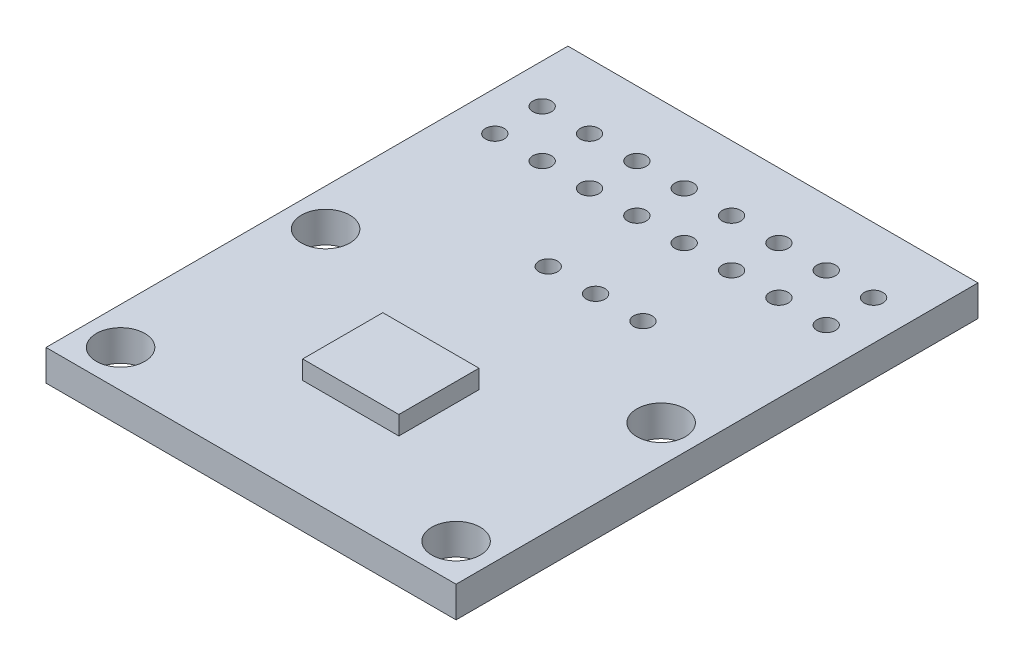
ISO-10303-21;
HEADER;
FILE_DESCRIPTION(('STEP AP214'),'2;1');
FILE_NAME('part.step','',(''),(''),'','','');
FILE_SCHEMA(('AUTOMOTIVE_DESIGN { 1 0 10303 214 1 1 1 1 }'));
ENDSEC;
DATA;
#1=APPLICATION_CONTEXT('core data for automotive mechanical design processes');
#2=APPLICATION_PROTOCOL_DEFINITION('international standard','automotive_design',2000,#1);
#3=PRODUCT_CONTEXT('',#1,'mechanical');
#4=PRODUCT('Part','Part','',(#3));
#5=PRODUCT_RELATED_PRODUCT_CATEGORY('part','',(#4));
#6=PRODUCT_DEFINITION_FORMATION('','',#4);
#7=PRODUCT_DEFINITION_CONTEXT('part definition',#1,'design');
#8=PRODUCT_DEFINITION('design','',#6,#7);
#9=PRODUCT_DEFINITION_SHAPE('','',#8);
#10=(LENGTH_UNIT() NAMED_UNIT(*) SI_UNIT(.MILLI.,.METRE.));
#11=(NAMED_UNIT(*) PLANE_ANGLE_UNIT() SI_UNIT($,.RADIAN.));
#12=(NAMED_UNIT(*) SI_UNIT($,.STERADIAN.) SOLID_ANGLE_UNIT());
#13=UNCERTAINTY_MEASURE_WITH_UNIT(LENGTH_MEASURE(1.E-05),#10,'distance_accuracy_value','');
#14=(GEOMETRIC_REPRESENTATION_CONTEXT(3) GLOBAL_UNCERTAINTY_ASSIGNED_CONTEXT((#13)) GLOBAL_UNIT_ASSIGNED_CONTEXT((#10,
#11,#12)) REPRESENTATION_CONTEXT('',''));
#15=CARTESIAN_POINT('',(0.,0.,0.));
#16=DIRECTION('',(0.,0.,1.));
#17=DIRECTION('',(1.,0.,0.));
#18=AXIS2_PLACEMENT_3D('',#15,#16,#17);
#19=CARTESIAN_POINT('',(0.,0.83,0.));
#20=DIRECTION('',(0.,1.,0.));
#21=DIRECTION('',(0.,0.,1.));
#22=AXIS2_PLACEMENT_3D('',#19,#20,#21);
#23=PLANE('',#22);
#24=CARTESIAN_POINT('',(6.35,0.83,-7.96862600459158));
#25=DIRECTION('',(0.,1.,0.));
#26=DIRECTION('',(0.,0.,1.));
#27=AXIS2_PLACEMENT_3D('',#24,#25,#26);
#28=CIRCLE('',#27,0.499999999999999);
#29=CARTESIAN_POINT('',(6.35,0.83,-7.46862600459158));
#30=VERTEX_POINT('',#29);
#31=EDGE_CURVE('E490',#30,#30,#28,.T.);
#32=ORIENTED_EDGE('',*,*,#31,.F.);
#33=EDGE_LOOP('',(#32));
#34=FACE_BOUND('',#33,.T.);
#35=CARTESIAN_POINT('',(3.81,0.83,-10.5086260045916));
#36=DIRECTION('',(0.,1.,0.));
#37=DIRECTION('',(0.,0.,1.));
#38=AXIS2_PLACEMENT_3D('',#35,#36,#37);
#39=CIRCLE('',#38,0.499999999999999);
#40=CARTESIAN_POINT('',(3.81,0.83,-10.0086260045916));
#41=VERTEX_POINT('',#40);
#42=EDGE_CURVE('E493',#41,#41,#39,.T.);
#43=ORIENTED_EDGE('',*,*,#42,.F.);
#44=EDGE_LOOP('',(#43));
#45=FACE_BOUND('',#44,.T.);
#46=CARTESIAN_POINT('',(3.81,0.83,-7.96862600459158));
#47=DIRECTION('',(0.,1.,0.));
#48=DIRECTION('',(0.,0.,1.));
#49=AXIS2_PLACEMENT_3D('',#46,#47,#48);
#50=CIRCLE('',#49,0.499999999999999);
#51=CARTESIAN_POINT('',(3.81,0.83,-7.46862600459158));
#52=VERTEX_POINT('',#51);
#53=EDGE_CURVE('E510',#52,#52,#50,.T.);
#54=ORIENTED_EDGE('',*,*,#53,.F.);
#55=EDGE_LOOP('',(#54));
#56=FACE_BOUND('',#55,.T.);
#57=CARTESIAN_POINT('',(1.27,0.83,-10.5086260045916));
#58=DIRECTION('',(0.,1.,0.));
#59=DIRECTION('',(0.,0.,1.));
#60=AXIS2_PLACEMENT_3D('',#57,#58,#59);
#61=CIRCLE('',#60,0.499999999999999);
#62=CARTESIAN_POINT('',(1.27,0.83,-10.0086260045916));
#63=VERTEX_POINT('',#62);
#64=EDGE_CURVE('E504',#63,#63,#61,.T.);
#65=ORIENTED_EDGE('',*,*,#64,.F.);
#66=EDGE_LOOP('',(#65));
#67=FACE_BOUND('',#66,.T.);
#68=CARTESIAN_POINT('',(-1.28836294207396,0.83,-3.23273590840458));
#69=DIRECTION('',(0.,1.,0.));
#70=DIRECTION('',(0.,0.,1.));
#71=AXIS2_PLACEMENT_3D('',#68,#69,#70);
#72=CIRCLE('',#71,0.499999999999999);
#73=CARTESIAN_POINT('',(-1.28836294207396,0.83,-2.73273590840458));
#74=VERTEX_POINT('',#73);
#75=EDGE_CURVE('E665',#74,#74,#72,.T.);
#76=ORIENTED_EDGE('',*,*,#75,.F.);
#77=EDGE_LOOP('',(#76));
#78=FACE_BOUND('',#77,.T.);
#79=CARTESIAN_POINT('',(8.89,0.83,-10.5086260045916));
#80=DIRECTION('',(0.,1.,0.));
#81=DIRECTION('',(0.,0.,1.));
#82=AXIS2_PLACEMENT_3D('',#79,#80,#81);
#83=CIRCLE('',#82,0.499999999999999);
#84=CARTESIAN_POINT('',(8.89,0.83,-10.0086260045916));
#85=VERTEX_POINT('',#84);
#86=EDGE_CURVE('E659',#85,#85,#83,.T.);
#87=ORIENTED_EDGE('',*,*,#86,.F.);
#88=EDGE_LOOP('',(#87));
#89=FACE_BOUND('',#88,.T.);
#90=CARTESIAN_POINT('',(8.89,0.83,-7.96862600459158));
#91=DIRECTION('',(0.,1.,0.));
#92=DIRECTION('',(0.,0.,1.));
#93=AXIS2_PLACEMENT_3D('',#90,#91,#92);
#94=CIRCLE('',#93,0.499999999999999);
#95=CARTESIAN_POINT('',(8.89,0.83,-7.46862600459158));
#96=VERTEX_POINT('',#95);
#97=EDGE_CURVE('E658',#96,#96,#94,.T.);
#98=ORIENTED_EDGE('',*,*,#97,.F.);
#99=EDGE_LOOP('',(#98));
#100=FACE_BOUND('',#99,.T.);
#101=CARTESIAN_POINT('',(6.35,0.83,-10.5086260045916));
#102=DIRECTION('',(0.,1.,0.));
#103=DIRECTION('',(0.,0.,1.));
#104=AXIS2_PLACEMENT_3D('',#101,#102,#103);
#105=CIRCLE('',#104,0.499999999999999);
#106=CARTESIAN_POINT('',(6.35,0.83,-10.0086260045916));
#107=VERTEX_POINT('',#106);
#108=EDGE_CURVE('E496',#107,#107,#105,.T.);
#109=ORIENTED_EDGE('',*,*,#108,.F.);
#110=EDGE_LOOP('',(#109));
#111=FACE_BOUND('',#110,.T.);
#112=CARTESIAN_POINT('',(-3.81,0.83,-7.96862600459158));
#113=DIRECTION('',(0.,1.,0.));
#114=DIRECTION('',(0.,0.,1.));
#115=AXIS2_PLACEMENT_3D('',#112,#113,#114);
#116=CIRCLE('',#115,0.499999999999999);
#117=CARTESIAN_POINT('',(-3.81,0.83,-7.46862600459158));
#118=VERTEX_POINT('',#117);
#119=EDGE_CURVE('E529',#118,#118,#116,.T.);
#120=ORIENTED_EDGE('',*,*,#119,.F.);
#121=EDGE_LOOP('',(#120));
#122=FACE_BOUND('',#121,.T.);
#123=CARTESIAN_POINT('',(-6.35,0.83,-10.5086260045916));
#124=DIRECTION('',(0.,1.,0.));
#125=DIRECTION('',(0.,0.,1.));
#126=AXIS2_PLACEMENT_3D('',#123,#124,#125);
#127=CIRCLE('',#126,0.499999999999999);
#128=CARTESIAN_POINT('',(-6.35,0.83,-10.0086260045916));
#129=VERTEX_POINT('',#128);
#130=EDGE_CURVE('E542',#129,#129,#127,.T.);
#131=ORIENTED_EDGE('',*,*,#130,.F.);
#132=EDGE_LOOP('',(#131));
#133=FACE_BOUND('',#132,.T.);
#134=CARTESIAN_POINT('',(-6.35,0.83,-7.96862600459158));
#135=DIRECTION('',(0.,1.,0.));
#136=DIRECTION('',(0.,0.,1.));
#137=AXIS2_PLACEMENT_3D('',#134,#135,#136);
#138=CIRCLE('',#137,0.499999999999999);
#139=CARTESIAN_POINT('',(-6.35,0.83,-7.46862600459158));
#140=VERTEX_POINT('',#139);
#141=EDGE_CURVE('E541',#140,#140,#138,.T.);
#142=ORIENTED_EDGE('',*,*,#141,.F.);
#143=EDGE_LOOP('',(#142));
#144=FACE_BOUND('',#143,.T.);
#145=CARTESIAN_POINT('',(-8.89,0.83,-10.5086260045916));
#146=DIRECTION('',(0.,1.,0.));
#147=DIRECTION('',(0.,0.,1.));
#148=AXIS2_PLACEMENT_3D('',#145,#146,#147);
#149=CIRCLE('',#148,0.499999999999999);
#150=CARTESIAN_POINT('',(-8.89,0.83,-10.0086260045916));
#151=VERTEX_POINT('',#150);
#152=EDGE_CURVE('E554',#151,#151,#149,.T.);
#153=ORIENTED_EDGE('',*,*,#152,.F.);
#154=EDGE_LOOP('',(#153));
#155=FACE_BOUND('',#154,.T.);
#156=CARTESIAN_POINT('',(1.27,0.83,-7.96862600459158));
#157=DIRECTION('',(0.,1.,0.));
#158=DIRECTION('',(0.,0.,1.));
#159=AXIS2_PLACEMENT_3D('',#156,#157,#158);
#160=CIRCLE('',#159,0.499999999999999);
#161=CARTESIAN_POINT('',(1.27,0.83,-7.46862600459158));
#162=VERTEX_POINT('',#161);
#163=EDGE_CURVE('E503',#162,#162,#160,.T.);
#164=ORIENTED_EDGE('',*,*,#163,.F.);
#165=EDGE_LOOP('',(#164));
#166=FACE_BOUND('',#165,.T.);
#167=CARTESIAN_POINT('',(-1.27,0.83,-10.5086260045916));
#168=DIRECTION('',(0.,1.,0.));
#169=DIRECTION('',(0.,0.,1.));
#170=AXIS2_PLACEMENT_3D('',#167,#168,#169);
#171=CIRCLE('',#170,0.499999999999999);
#172=CARTESIAN_POINT('',(-1.27,0.83,-10.0086260045916));
#173=VERTEX_POINT('',#172);
#174=EDGE_CURVE('E518',#173,#173,#171,.T.);
#175=ORIENTED_EDGE('',*,*,#174,.F.);
#176=EDGE_LOOP('',(#175));
#177=FACE_BOUND('',#176,.T.);
#178=CARTESIAN_POINT('',(-1.27,0.83,-7.96862600459158));
#179=DIRECTION('',(0.,1.,0.));
#180=DIRECTION('',(0.,0.,1.));
#181=AXIS2_PLACEMENT_3D('',#178,#179,#180);
#182=CIRCLE('',#181,0.499999999999999);
#183=CARTESIAN_POINT('',(-1.27,0.83,-7.46862600459158));
#184=VERTEX_POINT('',#183);
#185=EDGE_CURVE('E517',#184,#184,#182,.T.);
#186=ORIENTED_EDGE('',*,*,#185,.F.);
#187=EDGE_LOOP('',(#186));
#188=FACE_BOUND('',#187,.T.);
#189=CARTESIAN_POINT('',(-3.81,0.83,-10.5086260045916));
#190=DIRECTION('',(0.,1.,0.));
#191=DIRECTION('',(0.,0.,1.));
#192=AXIS2_PLACEMENT_3D('',#189,#190,#191);
#193=CIRCLE('',#192,0.499999999999999);
#194=CARTESIAN_POINT('',(-3.81,0.83,-10.0086260045916));
#195=VERTEX_POINT('',#194);
#196=EDGE_CURVE('E530',#195,#195,#193,.T.);
#197=ORIENTED_EDGE('',*,*,#196,.F.);
#198=EDGE_LOOP('',(#197));
#199=FACE_BOUND('',#198,.T.);
#200=CARTESIAN_POINT('',(1.25163705792605,0.83,-3.23273590840458));
#201=DIRECTION('',(0.,1.,0.));
#202=DIRECTION('',(0.,0.,1.));
#203=AXIS2_PLACEMENT_3D('',#200,#201,#202);
#204=CIRCLE('',#203,0.499999999999999);
#205=CARTESIAN_POINT('',(1.25163705792605,0.83,-2.73273590840458));
#206=VERTEX_POINT('',#205);
#207=EDGE_CURVE('E644',#206,#206,#204,.T.);
#208=ORIENTED_EDGE('',*,*,#207,.F.);
#209=EDGE_LOOP('',(#208));
#210=FACE_BOUND('',#209,.T.);
#211=CARTESIAN_POINT('',(3.79163705792605,0.83,-3.23273590840458));
#212=DIRECTION('',(0.,1.,0.));
#213=DIRECTION('',(0.,0.,1.));
#214=AXIS2_PLACEMENT_3D('',#211,#212,#213);
#215=CIRCLE('',#214,0.499999999999999);
#216=CARTESIAN_POINT('',(3.79163705792605,0.83,-2.73273590840458));
#217=VERTEX_POINT('',#216);
#218=EDGE_CURVE('E647',#217,#217,#215,.T.);
#219=ORIENTED_EDGE('',*,*,#218,.F.);
#220=EDGE_LOOP('',(#219));
#221=FACE_BOUND('',#220,.T.);
#222=CARTESIAN_POINT('',(-8.89,0.83,-7.96862600459158));
#223=DIRECTION('',(0.,1.,0.));
#224=DIRECTION('',(0.,0.,1.));
#225=AXIS2_PLACEMENT_3D('',#222,#223,#224);
#226=CIRCLE('',#225,0.499999999999999);
#227=CARTESIAN_POINT('',(-8.89,0.83,-7.46862600459158));
#228=VERTEX_POINT('',#227);
#229=EDGE_CURVE('E553',#228,#228,#226,.T.);
#230=ORIENTED_EDGE('',*,*,#229,.F.);
#231=EDGE_LOOP('',(#230));
#232=FACE_BOUND('',#231,.T.);
#233=CARTESIAN_POINT('',(-9.,0.83,1.));
#234=DIRECTION('',(0.,1.,0.));
#235=DIRECTION('',(0.,0.,1.));
#236=AXIS2_PLACEMENT_3D('',#233,#234,#235);
#237=CIRCLE('',#236,1.29999999999999);
#238=CARTESIAN_POINT('',(-9.,0.83,2.29999999999999));
#239=VERTEX_POINT('',#238);
#240=EDGE_CURVE('E570',#239,#239,#237,.T.);
#241=ORIENTED_EDGE('',*,*,#240,.F.);
#242=EDGE_LOOP('',(#241));
#243=FACE_BOUND('',#242,.T.);
#244=CARTESIAN_POINT('',(9.,0.83,1.));
#245=DIRECTION('',(0.,1.,0.));
#246=DIRECTION('',(0.,0.,1.));
#247=AXIS2_PLACEMENT_3D('',#244,#245,#246);
#248=CIRCLE('',#247,1.29999999999999);
#249=CARTESIAN_POINT('',(9.,0.83,2.29999999999999));
#250=VERTEX_POINT('',#249);
#251=EDGE_CURVE('E576',#250,#250,#248,.T.);
#252=ORIENTED_EDGE('',*,*,#251,.F.);
#253=EDGE_LOOP('',(#252));
#254=FACE_BOUND('',#253,.T.);
#255=CARTESIAN_POINT('',(-9.,0.83,12.));
#256=DIRECTION('',(0.,1.,0.));
#257=DIRECTION('',(0.,0.,1.));
#258=AXIS2_PLACEMENT_3D('',#255,#256,#257);
#259=CIRCLE('',#258,1.29999999999999);
#260=CARTESIAN_POINT('',(-9.,0.83,13.3));
#261=VERTEX_POINT('',#260);
#262=EDGE_CURVE('E582',#261,#261,#259,.T.);
#263=ORIENTED_EDGE('',*,*,#262,.F.);
#264=EDGE_LOOP('',(#263));
#265=FACE_BOUND('',#264,.T.);
#266=CARTESIAN_POINT('',(9.,0.83,12.));
#267=DIRECTION('',(0.,1.,0.));
#268=DIRECTION('',(0.,0.,1.));
#269=AXIS2_PLACEMENT_3D('',#266,#267,#268);
#270=CIRCLE('',#269,1.29999999999999);
#271=CARTESIAN_POINT('',(9.,0.83,13.3));
#272=VERTEX_POINT('',#271);
#273=EDGE_CURVE('E588',#272,#272,#270,.T.);
#274=ORIENTED_EDGE('',*,*,#273,.F.);
#275=EDGE_LOOP('',(#274));
#276=FACE_BOUND('',#275,.T.);
#277=DIRECTION('',(1.,0.,0.));
#278=VECTOR('',#277,1.);
#279=CARTESIAN_POINT('',(-11.,0.83,14.));
#280=LINE('',#279,#278);
#281=CARTESIAN_POINT('',(-11.,0.83,14.));
#282=VERTEX_POINT('',#281);
#283=CARTESIAN_POINT('',(11.,0.83,14.));
#284=VERTEX_POINT('',#283);
#285=EDGE_CURVE('E132',#282,#284,#280,.T.);
#286=ORIENTED_EDGE('',*,*,#285,.T.);
#287=DIRECTION('',(0.,0.,-1.));
#288=VECTOR('',#287,1.);
#289=CARTESIAN_POINT('',(11.,0.83,14.));
#290=LINE('',#289,#288);
#291=CARTESIAN_POINT('',(11.,0.83,-14.));
#292=VERTEX_POINT('',#291);
#293=EDGE_CURVE('E135',#284,#292,#290,.T.);
#294=ORIENTED_EDGE('',*,*,#293,.T.);
#295=DIRECTION('',(-1.,0.,0.));
#296=VECTOR('',#295,1.);
#297=CARTESIAN_POINT('',(11.,0.83,-14.));
#298=LINE('',#297,#296);
#299=CARTESIAN_POINT('',(-11.,0.83,-14.));
#300=VERTEX_POINT('',#299);
#301=EDGE_CURVE('E152',#292,#300,#298,.T.);
#302=ORIENTED_EDGE('',*,*,#301,.T.);
#303=DIRECTION('',(0.,0.,1.));
#304=VECTOR('',#303,1.);
#305=CARTESIAN_POINT('',(-11.,0.83,-14.));
#306=LINE('',#305,#304);
#307=EDGE_CURVE('E143',#300,#282,#306,.T.);
#308=ORIENTED_EDGE('',*,*,#307,.T.);
#309=EDGE_LOOP('',(#286,#294,#302,#308));
#310=FACE_BOUND('',#309,.T.);
#311=DIRECTION('',(-1.,0.,0.));
#312=VECTOR('',#311,1.);
#313=CARTESIAN_POINT('',(-2.58,0.83,4.35));
#314=LINE('',#313,#312);
#315=CARTESIAN_POINT('',(2.58,0.83,4.35));
#316=VERTEX_POINT('',#315);
#317=CARTESIAN_POINT('',(-2.58,0.83,4.35));
#318=VERTEX_POINT('',#317);
#319=EDGE_CURVE('E595',#316,#318,#314,.T.);
#320=ORIENTED_EDGE('',*,*,#319,.F.);
#321=DIRECTION('',(0.,0.,-1.));
#322=VECTOR('',#321,1.);
#323=CARTESIAN_POINT('',(2.58,0.83,4.35));
#324=LINE('',#323,#322);
#325=CARTESIAN_POINT('',(2.58,0.83,8.65));
#326=VERTEX_POINT('',#325);
#327=EDGE_CURVE('E130',#326,#316,#324,.T.);
#328=ORIENTED_EDGE('',*,*,#327,.F.);
#329=DIRECTION('',(1.,0.,0.));
#330=VECTOR('',#329,1.);
#331=CARTESIAN_POINT('',(2.58,0.83,8.65));
#332=LINE('',#331,#330);
#333=CARTESIAN_POINT('',(-2.58,0.83,8.65));
#334=VERTEX_POINT('',#333);
#335=EDGE_CURVE('E126',#334,#326,#332,.T.);
#336=ORIENTED_EDGE('',*,*,#335,.F.);
#337=DIRECTION('',(0.,0.,1.));
#338=VECTOR('',#337,1.);
#339=CARTESIAN_POINT('',(-2.58,0.83,8.65));
#340=LINE('',#339,#338);
#341=EDGE_CURVE('E597',#318,#334,#340,.T.);
#342=ORIENTED_EDGE('',*,*,#341,.F.);
#343=EDGE_LOOP('',(#320,#328,#336,#342));
#344=FACE_BOUND('',#343,.T.);
#345=ADVANCED_FACE('F34',(#34,#45,#56,#67,#78,#89,#100,#111,#122,#133,#144,#155,#166,#177,#188,
#199,#210,#221,#232,#243,#254,#265,#276,#310,#344),#23,.T.);
#346=CARTESIAN_POINT('',(-11.,-0.83,14.));
#347=DIRECTION('',(0.,0.,1.));
#348=DIRECTION('',(1.,0.,0.));
#349=AXIS2_PLACEMENT_3D('',#346,#347,#348);
#350=PLANE('',#349);
#351=ORIENTED_EDGE('',*,*,#285,.F.);
#352=DIRECTION('',(0.,1.,0.));
#353=VECTOR('',#352,1.);
#354=CARTESIAN_POINT('',(-11.,-0.83,14.));
#355=LINE('',#354,#353);
#356=CARTESIAN_POINT('',(-11.,-0.83,14.));
#357=VERTEX_POINT('',#356);
#358=EDGE_CURVE('E11',#357,#282,#355,.T.);
#359=ORIENTED_EDGE('',*,*,#358,.F.);
#360=DIRECTION('',(1.,0.,0.));
#361=VECTOR('',#360,1.);
#362=CARTESIAN_POINT('',(-11.,-0.83,14.));
#363=LINE('',#362,#361);
#364=CARTESIAN_POINT('',(11.,-0.83,14.));
#365=VERTEX_POINT('',#364);
#366=EDGE_CURVE('E140',#357,#365,#363,.T.);
#367=ORIENTED_EDGE('',*,*,#366,.T.);
#368=DIRECTION('',(0.,1.,0.));
#369=VECTOR('',#368,1.);
#370=CARTESIAN_POINT('',(11.,-0.83,14.));
#371=LINE('',#370,#369);
#372=EDGE_CURVE('E38',#365,#284,#371,.T.);
#373=ORIENTED_EDGE('',*,*,#372,.T.);
#374=EDGE_LOOP('',(#351,#359,#367,#373));
#375=FACE_BOUND('',#374,.T.);
#376=ADVANCED_FACE('F36',(#375),#350,.T.);
#377=CARTESIAN_POINT('',(-11.,-0.83,-14.));
#378=DIRECTION('',(-1.,0.,0.));
#379=DIRECTION('',(0.,0.,1.));
#380=AXIS2_PLACEMENT_3D('',#377,#378,#379);
#381=PLANE('',#380);
#382=ORIENTED_EDGE('',*,*,#307,.F.);
#383=DIRECTION('',(0.,1.,0.));
#384=VECTOR('',#383,1.);
#385=CARTESIAN_POINT('',(-11.,-0.83,-14.));
#386=LINE('',#385,#384);
#387=CARTESIAN_POINT('',(-11.,-0.83,-14.));
#388=VERTEX_POINT('',#387);
#389=EDGE_CURVE('E43',#388,#300,#386,.T.);
#390=ORIENTED_EDGE('',*,*,#389,.F.);
#391=DIRECTION('',(0.,0.,1.));
#392=VECTOR('',#391,1.);
#393=CARTESIAN_POINT('',(-11.,-0.83,-14.));
#394=LINE('',#393,#392);
#395=EDGE_CURVE('E148',#388,#357,#394,.T.);
#396=ORIENTED_EDGE('',*,*,#395,.T.);
#397=ORIENTED_EDGE('',*,*,#358,.T.);
#398=EDGE_LOOP('',(#382,#390,#396,#397));
#399=FACE_BOUND('',#398,.T.);
#400=ADVANCED_FACE('F162',(#399),#381,.T.);
#401=CARTESIAN_POINT('',(11.,-0.83,-14.));
#402=DIRECTION('',(0.,0.,-1.));
#403=DIRECTION('',(-1.,0.,0.));
#404=AXIS2_PLACEMENT_3D('',#401,#402,#403);
#405=PLANE('',#404);
#406=ORIENTED_EDGE('',*,*,#301,.F.);
#407=DIRECTION('',(0.,1.,0.));
#408=VECTOR('',#407,1.);
#409=CARTESIAN_POINT('',(11.,-0.83,-14.));
#410=LINE('',#409,#408);
#411=CARTESIAN_POINT('',(11.,-0.83,-14.));
#412=VERTEX_POINT('',#411);
#413=EDGE_CURVE('E157',#412,#292,#410,.T.);
#414=ORIENTED_EDGE('',*,*,#413,.F.);
#415=DIRECTION('',(-1.,0.,0.));
#416=VECTOR('',#415,1.);
#417=CARTESIAN_POINT('',(11.,-0.83,-14.));
#418=LINE('',#417,#416);
#419=EDGE_CURVE('E145',#412,#388,#418,.T.);
#420=ORIENTED_EDGE('',*,*,#419,.T.);
#421=ORIENTED_EDGE('',*,*,#389,.T.);
#422=EDGE_LOOP('',(#406,#414,#420,#421));
#423=FACE_BOUND('',#422,.T.);
#424=ADVANCED_FACE('F166',(#423),#405,.T.);
#425=CARTESIAN_POINT('',(11.,-0.83,14.));
#426=DIRECTION('',(1.,0.,0.));
#427=DIRECTION('',(0.,0.,-1.));
#428=AXIS2_PLACEMENT_3D('',#425,#426,#427);
#429=PLANE('',#428);
#430=ORIENTED_EDGE('',*,*,#293,.F.);
#431=ORIENTED_EDGE('',*,*,#372,.F.);
#432=DIRECTION('',(0.,0.,-1.));
#433=VECTOR('',#432,1.);
#434=CARTESIAN_POINT('',(11.,-0.83,14.));
#435=LINE('',#434,#433);
#436=EDGE_CURVE('E142',#365,#412,#435,.T.);
#437=ORIENTED_EDGE('',*,*,#436,.T.);
#438=ORIENTED_EDGE('',*,*,#413,.T.);
#439=EDGE_LOOP('',(#430,#431,#437,#438));
#440=FACE_BOUND('',#439,.T.);
#441=ADVANCED_FACE('F159',(#440),#429,.T.);
#442=CARTESIAN_POINT('',(0.,-0.83,0.));
#443=DIRECTION('',(0.,1.,0.));
#444=DIRECTION('',(0.,0.,1.));
#445=AXIS2_PLACEMENT_3D('',#442,#443,#444);
#446=PLANE('',#445);
#447=CARTESIAN_POINT('',(6.35,-0.830000000000001,-7.96862600459158));
#448=DIRECTION('',(0.,1.,0.));
#449=DIRECTION('',(0.,0.,1.));
#450=AXIS2_PLACEMENT_3D('',#447,#448,#449);
#451=CIRCLE('',#450,0.499999999999999);
#452=CARTESIAN_POINT('',(6.35,-0.830000000000001,-7.46862600459158));
#453=VERTEX_POINT('',#452);
#454=EDGE_CURVE('E488',#453,#453,#451,.T.);
#455=ORIENTED_EDGE('',*,*,#454,.T.);
#456=EDGE_LOOP('',(#455));
#457=FACE_BOUND('',#456,.T.);
#458=CARTESIAN_POINT('',(3.81,-0.830000000000001,-10.5086260045916));
#459=DIRECTION('',(0.,1.,0.));
#460=DIRECTION('',(0.,0.,1.));
#461=AXIS2_PLACEMENT_3D('',#458,#459,#460);
#462=CIRCLE('',#461,0.499999999999999);
#463=CARTESIAN_POINT('',(3.81,-0.830000000000001,-10.0086260045916));
#464=VERTEX_POINT('',#463);
#465=EDGE_CURVE('E513',#464,#464,#462,.T.);
#466=ORIENTED_EDGE('',*,*,#465,.T.);
#467=EDGE_LOOP('',(#466));
#468=FACE_BOUND('',#467,.T.);
#469=CARTESIAN_POINT('',(3.81,-0.830000000000001,-7.96862600459158));
#470=DIRECTION('',(0.,1.,0.));
#471=DIRECTION('',(0.,0.,1.));
#472=AXIS2_PLACEMENT_3D('',#469,#470,#471);
#473=CIRCLE('',#472,0.499999999999999);
#474=CARTESIAN_POINT('',(3.81,-0.830000000000001,-7.46862600459158));
#475=VERTEX_POINT('',#474);
#476=EDGE_CURVE('E507',#475,#475,#473,.T.);
#477=ORIENTED_EDGE('',*,*,#476,.T.);
#478=EDGE_LOOP('',(#477));
#479=FACE_BOUND('',#478,.T.);
#480=CARTESIAN_POINT('',(1.27,-0.830000000000001,-10.5086260045916));
#481=DIRECTION('',(0.,1.,0.));
#482=DIRECTION('',(0.,0.,1.));
#483=AXIS2_PLACEMENT_3D('',#480,#481,#482);
#484=CIRCLE('',#483,0.499999999999999);
#485=CARTESIAN_POINT('',(1.27,-0.830000000000001,-10.0086260045916));
#486=VERTEX_POINT('',#485);
#487=EDGE_CURVE('E500',#486,#486,#484,.T.);
#488=ORIENTED_EDGE('',*,*,#487,.T.);
#489=EDGE_LOOP('',(#488));
#490=FACE_BOUND('',#489,.T.);
#491=CARTESIAN_POINT('',(-1.28836294207396,-0.830000000000001,-3.23273590840458));
#492=DIRECTION('',(0.,1.,0.));
#493=DIRECTION('',(0.,0.,1.));
#494=AXIS2_PLACEMENT_3D('',#491,#492,#493);
#495=CIRCLE('',#494,0.499999999999999);
#496=CARTESIAN_POINT('',(-1.28836294207396,-0.830000000000001,-2.73273590840458));
#497=VERTEX_POINT('',#496);
#498=EDGE_CURVE('E662',#497,#497,#495,.T.);
#499=ORIENTED_EDGE('',*,*,#498,.T.);
#500=EDGE_LOOP('',(#499));
#501=FACE_BOUND('',#500,.T.);
#502=CARTESIAN_POINT('',(8.89,-0.830000000000001,-10.5086260045916));
#503=DIRECTION('',(0.,1.,0.));
#504=DIRECTION('',(0.,0.,1.));
#505=AXIS2_PLACEMENT_3D('',#502,#503,#504);
#506=CIRCLE('',#505,0.499999999999999);
#507=CARTESIAN_POINT('',(8.89,-0.830000000000001,-10.0086260045916));
#508=VERTEX_POINT('',#507);
#509=EDGE_CURVE('E655',#508,#508,#506,.T.);
#510=ORIENTED_EDGE('',*,*,#509,.T.);
#511=EDGE_LOOP('',(#510));
#512=FACE_BOUND('',#511,.T.);
#513=CARTESIAN_POINT('',(8.89,-0.830000000000001,-7.96862600459158));
#514=DIRECTION('',(0.,1.,0.));
#515=DIRECTION('',(0.,0.,1.));
#516=AXIS2_PLACEMENT_3D('',#513,#514,#515);
#517=CIRCLE('',#516,0.499999999999999);
#518=CARTESIAN_POINT('',(8.89,-0.830000000000001,-7.46862600459158));
#519=VERTEX_POINT('',#518);
#520=EDGE_CURVE('E671',#519,#519,#517,.T.);
#521=ORIENTED_EDGE('',*,*,#520,.T.);
#522=EDGE_LOOP('',(#521));
#523=FACE_BOUND('',#522,.T.);
#524=CARTESIAN_POINT('',(6.35,-0.830000000000001,-10.5086260045916));
#525=DIRECTION('',(0.,1.,0.));
#526=DIRECTION('',(0.,0.,1.));
#527=AXIS2_PLACEMENT_3D('',#524,#525,#526);
#528=CIRCLE('',#527,0.499999999999999);
#529=CARTESIAN_POINT('',(6.35,-0.830000000000001,-10.0086260045916));
#530=VERTEX_POINT('',#529);
#531=EDGE_CURVE('E491',#530,#530,#528,.T.);
#532=ORIENTED_EDGE('',*,*,#531,.T.);
#533=EDGE_LOOP('',(#532));
#534=FACE_BOUND('',#533,.T.);
#535=CARTESIAN_POINT('',(-3.81,-0.830000000000001,-7.96862600459158));
#536=DIRECTION('',(0.,1.,0.));
#537=DIRECTION('',(0.,0.,1.));
#538=AXIS2_PLACEMENT_3D('',#535,#536,#537);
#539=CIRCLE('',#538,0.499999999999999);
#540=CARTESIAN_POINT('',(-3.81,-0.830000000000001,-7.46862600459158));
#541=VERTEX_POINT('',#540);
#542=EDGE_CURVE('E545',#541,#541,#539,.T.);
#543=ORIENTED_EDGE('',*,*,#542,.T.);
#544=EDGE_LOOP('',(#543));
#545=FACE_BOUND('',#544,.T.);
#546=CARTESIAN_POINT('',(-6.35,-0.830000000000001,-10.5086260045916));
#547=DIRECTION('',(0.,1.,0.));
#548=DIRECTION('',(0.,0.,1.));
#549=AXIS2_PLACEMENT_3D('',#546,#547,#548);
#550=CIRCLE('',#549,0.499999999999999);
#551=CARTESIAN_POINT('',(-6.35,-0.830000000000001,-10.0086260045916));
#552=VERTEX_POINT('',#551);
#553=EDGE_CURVE('E538',#552,#552,#550,.T.);
#554=ORIENTED_EDGE('',*,*,#553,.T.);
#555=EDGE_LOOP('',(#554));
#556=FACE_BOUND('',#555,.T.);
#557=CARTESIAN_POINT('',(-6.35,-0.830000000000001,-7.96862600459158));
#558=DIRECTION('',(0.,1.,0.));
#559=DIRECTION('',(0.,0.,1.));
#560=AXIS2_PLACEMENT_3D('',#557,#558,#559);
#561=CIRCLE('',#560,0.499999999999999);
#562=CARTESIAN_POINT('',(-6.35,-0.830000000000001,-7.46862600459158));
#563=VERTEX_POINT('',#562);
#564=EDGE_CURVE('E557',#563,#563,#561,.T.);
#565=ORIENTED_EDGE('',*,*,#564,.T.);
#566=EDGE_LOOP('',(#565));
#567=FACE_BOUND('',#566,.T.);
#568=CARTESIAN_POINT('',(-8.89,-0.830000000000001,-10.5086260045916));
#569=DIRECTION('',(0.,1.,0.));
#570=DIRECTION('',(0.,0.,1.));
#571=AXIS2_PLACEMENT_3D('',#568,#569,#570);
#572=CIRCLE('',#571,0.499999999999999);
#573=CARTESIAN_POINT('',(-8.89,-0.830000000000001,-10.0086260045916));
#574=VERTEX_POINT('',#573);
#575=EDGE_CURVE('E550',#574,#574,#572,.T.);
#576=ORIENTED_EDGE('',*,*,#575,.T.);
#577=EDGE_LOOP('',(#576));
#578=FACE_BOUND('',#577,.T.);
#579=CARTESIAN_POINT('',(1.27,-0.830000000000001,-7.96862600459158));
#580=DIRECTION('',(0.,1.,0.));
#581=DIRECTION('',(0.,0.,1.));
#582=AXIS2_PLACEMENT_3D('',#579,#580,#581);
#583=CIRCLE('',#582,0.499999999999999);
#584=CARTESIAN_POINT('',(1.27,-0.830000000000001,-7.46862600459158));
#585=VERTEX_POINT('',#584);
#586=EDGE_CURVE('E521',#585,#585,#583,.T.);
#587=ORIENTED_EDGE('',*,*,#586,.T.);
#588=EDGE_LOOP('',(#587));
#589=FACE_BOUND('',#588,.T.);
#590=CARTESIAN_POINT('',(-1.27,-0.830000000000001,-10.5086260045916));
#591=DIRECTION('',(0.,1.,0.));
#592=DIRECTION('',(0.,0.,1.));
#593=AXIS2_PLACEMENT_3D('',#590,#591,#592);
#594=CIRCLE('',#593,0.499999999999999);
#595=CARTESIAN_POINT('',(-1.27,-0.830000000000001,-10.0086260045916));
#596=VERTEX_POINT('',#595);
#597=EDGE_CURVE('E514',#596,#596,#594,.T.);
#598=ORIENTED_EDGE('',*,*,#597,.T.);
#599=EDGE_LOOP('',(#598));
#600=FACE_BOUND('',#599,.T.);
#601=CARTESIAN_POINT('',(-1.27,-0.830000000000001,-7.96862600459158));
#602=DIRECTION('',(0.,1.,0.));
#603=DIRECTION('',(0.,0.,1.));
#604=AXIS2_PLACEMENT_3D('',#601,#602,#603);
#605=CIRCLE('',#604,0.499999999999999);
#606=CARTESIAN_POINT('',(-1.27,-0.830000000000001,-7.46862600459158));
#607=VERTEX_POINT('',#606);
#608=EDGE_CURVE('E533',#607,#607,#605,.T.);
#609=ORIENTED_EDGE('',*,*,#608,.T.);
#610=EDGE_LOOP('',(#609));
#611=FACE_BOUND('',#610,.T.);
#612=CARTESIAN_POINT('',(-3.81,-0.830000000000001,-10.5086260045916));
#613=DIRECTION('',(0.,1.,0.));
#614=DIRECTION('',(0.,0.,1.));
#615=AXIS2_PLACEMENT_3D('',#612,#613,#614);
#616=CIRCLE('',#615,0.499999999999999);
#617=CARTESIAN_POINT('',(-3.81,-0.830000000000001,-10.0086260045916));
#618=VERTEX_POINT('',#617);
#619=EDGE_CURVE('E526',#618,#618,#616,.T.);
#620=ORIENTED_EDGE('',*,*,#619,.T.);
#621=EDGE_LOOP('',(#620));
#622=FACE_BOUND('',#621,.T.);
#623=CARTESIAN_POINT('',(1.25163705792605,-0.830000000000001,-3.23273590840458));
#624=DIRECTION('',(0.,1.,0.));
#625=DIRECTION('',(0.,0.,1.));
#626=AXIS2_PLACEMENT_3D('',#623,#624,#625);
#627=CIRCLE('',#626,0.499999999999999);
#628=CARTESIAN_POINT('',(1.25163705792605,-0.830000000000001,-2.73273590840458));
#629=VERTEX_POINT('',#628);
#630=EDGE_CURVE('E667',#629,#629,#627,.T.);
#631=ORIENTED_EDGE('',*,*,#630,.T.);
#632=EDGE_LOOP('',(#631));
#633=FACE_BOUND('',#632,.T.);
#634=CARTESIAN_POINT('',(3.79163705792605,-0.830000000000001,-3.23273590840458));
#635=DIRECTION('',(0.,1.,0.));
#636=DIRECTION('',(0.,0.,1.));
#637=AXIS2_PLACEMENT_3D('',#634,#635,#636);
#638=CIRCLE('',#637,0.499999999999999);
#639=CARTESIAN_POINT('',(3.79163705792605,-0.830000000000001,-2.73273590840458));
#640=VERTEX_POINT('',#639);
#641=EDGE_CURVE('E649',#640,#640,#638,.T.);
#642=ORIENTED_EDGE('',*,*,#641,.T.);
#643=EDGE_LOOP('',(#642));
#644=FACE_BOUND('',#643,.T.);
#645=CARTESIAN_POINT('',(-8.89,-0.830000000000001,-7.96862600459158));
#646=DIRECTION('',(0.,1.,0.));
#647=DIRECTION('',(0.,0.,1.));
#648=AXIS2_PLACEMENT_3D('',#645,#646,#647);
#649=CIRCLE('',#648,0.499999999999999);
#650=CARTESIAN_POINT('',(-8.89,-0.830000000000001,-7.46862600459158));
#651=VERTEX_POINT('',#650);
#652=EDGE_CURVE('E562',#651,#651,#649,.T.);
#653=ORIENTED_EDGE('',*,*,#652,.T.);
#654=EDGE_LOOP('',(#653));
#655=FACE_BOUND('',#654,.T.);
#656=CARTESIAN_POINT('',(-9.,-0.830000000000001,1.));
#657=DIRECTION('',(0.,-1.,0.));
#658=DIRECTION('',(0.,0.,-1.));
#659=AXIS2_PLACEMENT_3D('',#656,#657,#658);
#660=CIRCLE('',#659,1.29999999999999);
#661=CARTESIAN_POINT('',(-9.,-0.830000000000001,-0.299999999999987));
#662=VERTEX_POINT('',#661);
#663=EDGE_CURVE('E565',#662,#662,#660,.T.);
#664=ORIENTED_EDGE('',*,*,#663,.F.);
#665=EDGE_LOOP('',(#664));
#666=FACE_BOUND('',#665,.T.);
#667=CARTESIAN_POINT('',(9.,-0.830000000000001,1.));
#668=DIRECTION('',(0.,-1.,0.));
#669=DIRECTION('',(0.,0.,-1.));
#670=AXIS2_PLACEMENT_3D('',#667,#668,#669);
#671=CIRCLE('',#670,1.29999999999999);
#672=CARTESIAN_POINT('',(9.,-0.830000000000001,-0.299999999999987));
#673=VERTEX_POINT('',#672);
#674=EDGE_CURVE('E573',#673,#673,#671,.T.);
#675=ORIENTED_EDGE('',*,*,#674,.F.);
#676=EDGE_LOOP('',(#675));
#677=FACE_BOUND('',#676,.T.);
#678=CARTESIAN_POINT('',(-9.,-0.830000000000001,12.));
#679=DIRECTION('',(0.,-1.,0.));
#680=DIRECTION('',(0.,0.,-1.));
#681=AXIS2_PLACEMENT_3D('',#678,#679,#680);
#682=CIRCLE('',#681,1.29999999999999);
#683=CARTESIAN_POINT('',(-9.,-0.830000000000001,10.7));
#684=VERTEX_POINT('',#683);
#685=EDGE_CURVE('E579',#684,#684,#682,.T.);
#686=ORIENTED_EDGE('',*,*,#685,.F.);
#687=EDGE_LOOP('',(#686));
#688=FACE_BOUND('',#687,.T.);
#689=CARTESIAN_POINT('',(9.,-0.830000000000001,12.));
#690=DIRECTION('',(0.,-1.,0.));
#691=DIRECTION('',(0.,0.,-1.));
#692=AXIS2_PLACEMENT_3D('',#689,#690,#691);
#693=CIRCLE('',#692,1.29999999999999);
#694=CARTESIAN_POINT('',(9.,-0.830000000000001,10.7));
#695=VERTEX_POINT('',#694);
#696=EDGE_CURVE('E585',#695,#695,#693,.T.);
#697=ORIENTED_EDGE('',*,*,#696,.F.);
#698=EDGE_LOOP('',(#697));
#699=FACE_BOUND('',#698,.T.);
#700=ORIENTED_EDGE('',*,*,#366,.F.);
#701=ORIENTED_EDGE('',*,*,#395,.F.);
#702=ORIENTED_EDGE('',*,*,#419,.F.);
#703=ORIENTED_EDGE('',*,*,#436,.F.);
#704=EDGE_LOOP('',(#700,#701,#702,#703));
#705=FACE_BOUND('',#704,.T.);
#706=ADVANCED_FACE('F168',(#457,#468,#479,#490,#501,#512,#523,#534,#545,#556,#567,#578,#589,
#600,#611,#622,#633,#644,#655,#666,#677,#688,#699,#705),#446,.F.);
#707=CARTESIAN_POINT('',(2.58,1.83,4.35));
#708=DIRECTION('',(-1.,0.,0.));
#709=DIRECTION('',(0.,0.,1.));
#710=AXIS2_PLACEMENT_3D('',#707,#708,#709);
#711=PLANE('',#710);
#712=ORIENTED_EDGE('',*,*,#327,.T.);
#713=DIRECTION('',(0.,-1.,0.));
#714=VECTOR('',#713,1.);
#715=CARTESIAN_POINT('',(2.58,1.83,4.35));
#716=LINE('',#715,#714);
#717=CARTESIAN_POINT('',(2.58,1.83,4.35));
#718=VERTEX_POINT('',#717);
#719=EDGE_CURVE('E111',#718,#316,#716,.T.);
#720=ORIENTED_EDGE('',*,*,#719,.F.);
#721=DIRECTION('',(0.,0.,-1.));
#722=VECTOR('',#721,1.);
#723=CARTESIAN_POINT('',(2.58,1.83,4.35));
#724=LINE('',#723,#722);
#725=CARTESIAN_POINT('',(2.58,1.83,8.65));
#726=VERTEX_POINT('',#725);
#727=EDGE_CURVE('E118',#726,#718,#724,.T.);
#728=ORIENTED_EDGE('',*,*,#727,.F.);
#729=DIRECTION('',(0.,-1.,0.));
#730=VECTOR('',#729,1.);
#731=CARTESIAN_POINT('',(2.58,1.83,8.65));
#732=LINE('',#731,#730);
#733=EDGE_CURVE('E593',#726,#326,#732,.T.);
#734=ORIENTED_EDGE('',*,*,#733,.T.);
#735=EDGE_LOOP('',(#712,#720,#728,#734));
#736=FACE_BOUND('',#735,.T.);
#737=ADVANCED_FACE('F128',(#736),#711,.F.);
#738=CARTESIAN_POINT('',(-2.58,1.83,4.35));
#739=DIRECTION('',(0.,0.,1.));
#740=DIRECTION('',(1.,0.,0.));
#741=AXIS2_PLACEMENT_3D('',#738,#739,#740);
#742=PLANE('',#741);
#743=ORIENTED_EDGE('',*,*,#319,.T.);
#744=DIRECTION('',(0.,-1.,0.));
#745=VECTOR('',#744,1.);
#746=CARTESIAN_POINT('',(-2.58,1.83,4.35));
#747=LINE('',#746,#745);
#748=CARTESIAN_POINT('',(-2.58,1.83,4.35));
#749=VERTEX_POINT('',#748);
#750=EDGE_CURVE('E114',#749,#318,#747,.T.);
#751=ORIENTED_EDGE('',*,*,#750,.F.);
#752=DIRECTION('',(-1.,0.,0.));
#753=VECTOR('',#752,1.);
#754=CARTESIAN_POINT('',(-2.58,1.83,4.35));
#755=LINE('',#754,#753);
#756=EDGE_CURVE('E107',#718,#749,#755,.T.);
#757=ORIENTED_EDGE('',*,*,#756,.F.);
#758=ORIENTED_EDGE('',*,*,#719,.T.);
#759=EDGE_LOOP('',(#743,#751,#757,#758));
#760=FACE_BOUND('',#759,.T.);
#761=ADVANCED_FACE('F109',(#760),#742,.F.);
#762=CARTESIAN_POINT('',(-2.58,1.83,8.65));
#763=DIRECTION('',(1.,0.,0.));
#764=DIRECTION('',(0.,0.,-1.));
#765=AXIS2_PLACEMENT_3D('',#762,#763,#764);
#766=PLANE('',#765);
#767=ORIENTED_EDGE('',*,*,#341,.T.);
#768=DIRECTION('',(0.,-1.,0.));
#769=VECTOR('',#768,1.);
#770=CARTESIAN_POINT('',(-2.58,1.83,8.65));
#771=LINE('',#770,#769);
#772=CARTESIAN_POINT('',(-2.58,1.83,8.65));
#773=VERTEX_POINT('',#772);
#774=EDGE_CURVE('E51',#773,#334,#771,.T.);
#775=ORIENTED_EDGE('',*,*,#774,.F.);
#776=DIRECTION('',(0.,0.,1.));
#777=VECTOR('',#776,1.);
#778=CARTESIAN_POINT('',(-2.58,1.83,8.65));
#779=LINE('',#778,#777);
#780=EDGE_CURVE('E117',#749,#773,#779,.T.);
#781=ORIENTED_EDGE('',*,*,#780,.F.);
#782=ORIENTED_EDGE('',*,*,#750,.T.);
#783=EDGE_LOOP('',(#767,#775,#781,#782));
#784=FACE_BOUND('',#783,.T.);
#785=ADVANCED_FACE('F216',(#784),#766,.F.);
#786=CARTESIAN_POINT('',(2.58,1.83,8.65));
#787=DIRECTION('',(0.,0.,-1.));
#788=DIRECTION('',(-1.,0.,0.));
#789=AXIS2_PLACEMENT_3D('',#786,#787,#788);
#790=PLANE('',#789);
#791=ORIENTED_EDGE('',*,*,#335,.T.);
#792=ORIENTED_EDGE('',*,*,#733,.F.);
#793=DIRECTION('',(1.,0.,0.));
#794=VECTOR('',#793,1.);
#795=CARTESIAN_POINT('',(2.58,1.83,8.65));
#796=LINE('',#795,#794);
#797=EDGE_CURVE('E122',#773,#726,#796,.T.);
#798=ORIENTED_EDGE('',*,*,#797,.F.);
#799=ORIENTED_EDGE('',*,*,#774,.T.);
#800=EDGE_LOOP('',(#791,#792,#798,#799));
#801=FACE_BOUND('',#800,.T.);
#802=ADVANCED_FACE('F225',(#801),#790,.F.);
#803=CARTESIAN_POINT('',(0.,1.83,0.));
#804=DIRECTION('',(0.,-1.,0.));
#805=DIRECTION('',(0.,0.,-1.));
#806=AXIS2_PLACEMENT_3D('',#803,#804,#805);
#807=PLANE('',#806);
#808=ORIENTED_EDGE('',*,*,#727,.T.);
#809=ORIENTED_EDGE('',*,*,#756,.T.);
#810=ORIENTED_EDGE('',*,*,#780,.T.);
#811=ORIENTED_EDGE('',*,*,#797,.T.);
#812=EDGE_LOOP('',(#808,#809,#810,#811));
#813=FACE_BOUND('',#812,.T.);
#814=ADVANCED_FACE('F121',(#813),#807,.F.);
#815=CARTESIAN_POINT('',(9.,-0.83,12.));
#816=DIRECTION('',(0.,-1.,0.));
#817=DIRECTION('',(0.,0.,-1.));
#818=AXIS2_PLACEMENT_3D('',#815,#816,#817);
#819=CYLINDRICAL_SURFACE('',#818,1.29999999999999);
#820=ORIENTED_EDGE('',*,*,#273,.T.);
#821=EDGE_LOOP('',(#820));
#822=FACE_BOUND('',#821,.T.);
#823=ORIENTED_EDGE('',*,*,#696,.T.);
#824=EDGE_LOOP('',(#823));
#825=FACE_BOUND('',#824,.T.);
#826=ADVANCED_FACE('F243',(#822,#825),#819,.F.);
#827=CARTESIAN_POINT('',(-9.,-0.83,12.));
#828=DIRECTION('',(0.,-1.,0.));
#829=DIRECTION('',(0.,0.,-1.));
#830=AXIS2_PLACEMENT_3D('',#827,#828,#829);
#831=CYLINDRICAL_SURFACE('',#830,1.29999999999999);
#832=ORIENTED_EDGE('',*,*,#262,.T.);
#833=EDGE_LOOP('',(#832));
#834=FACE_BOUND('',#833,.T.);
#835=ORIENTED_EDGE('',*,*,#685,.T.);
#836=EDGE_LOOP('',(#835));
#837=FACE_BOUND('',#836,.T.);
#838=ADVANCED_FACE('F253',(#834,#837),#831,.F.);
#839=CARTESIAN_POINT('',(9.,-0.83,1.));
#840=DIRECTION('',(0.,-1.,0.));
#841=DIRECTION('',(0.,0.,-1.));
#842=AXIS2_PLACEMENT_3D('',#839,#840,#841);
#843=CYLINDRICAL_SURFACE('',#842,1.29999999999999);
#844=ORIENTED_EDGE('',*,*,#251,.T.);
#845=EDGE_LOOP('',(#844));
#846=FACE_BOUND('',#845,.T.);
#847=ORIENTED_EDGE('',*,*,#674,.T.);
#848=EDGE_LOOP('',(#847));
#849=FACE_BOUND('',#848,.T.);
#850=ADVANCED_FACE('F265',(#846,#849),#843,.F.);
#851=CARTESIAN_POINT('',(-9.,-0.83,1.));
#852=DIRECTION('',(0.,-1.,0.));
#853=DIRECTION('',(0.,0.,-1.));
#854=AXIS2_PLACEMENT_3D('',#851,#852,#853);
#855=CYLINDRICAL_SURFACE('',#854,1.29999999999999);
#856=ORIENTED_EDGE('',*,*,#240,.T.);
#857=EDGE_LOOP('',(#856));
#858=FACE_BOUND('',#857,.T.);
#859=ORIENTED_EDGE('',*,*,#663,.T.);
#860=EDGE_LOOP('',(#859));
#861=FACE_BOUND('',#860,.T.);
#862=ADVANCED_FACE('F276',(#858,#861),#855,.F.);
#863=CARTESIAN_POINT('',(-8.89,-0.830000000000001,-7.96862600459158));
#864=DIRECTION('',(0.,1.,0.));
#865=DIRECTION('',(0.,0.,1.));
#866=AXIS2_PLACEMENT_3D('',#863,#864,#865);
#867=CYLINDRICAL_SURFACE('',#866,0.499999999999999);
#868=ORIENTED_EDGE('',*,*,#652,.F.);
#869=EDGE_LOOP('',(#868));
#870=FACE_BOUND('',#869,.T.);
#871=ORIENTED_EDGE('',*,*,#229,.T.);
#872=EDGE_LOOP('',(#871));
#873=FACE_BOUND('',#872,.T.);
#874=ADVANCED_FACE('F285',(#870,#873),#867,.F.);
#875=CARTESIAN_POINT('',(3.79163705792605,-0.830000000000001,-3.23273590840458));
#876=DIRECTION('',(0.,1.,0.));
#877=DIRECTION('',(0.,0.,1.));
#878=AXIS2_PLACEMENT_3D('',#875,#876,#877);
#879=CYLINDRICAL_SURFACE('',#878,0.499999999999999);
#880=ORIENTED_EDGE('',*,*,#641,.F.);
#881=EDGE_LOOP('',(#880));
#882=FACE_BOUND('',#881,.T.);
#883=ORIENTED_EDGE('',*,*,#218,.T.);
#884=EDGE_LOOP('',(#883));
#885=FACE_BOUND('',#884,.T.);
#886=ADVANCED_FACE('F302',(#882,#885),#879,.F.);
#887=CARTESIAN_POINT('',(1.25163705792605,-0.830000000000001,-3.23273590840458));
#888=DIRECTION('',(0.,1.,0.));
#889=DIRECTION('',(0.,0.,1.));
#890=AXIS2_PLACEMENT_3D('',#887,#888,#889);
#891=CYLINDRICAL_SURFACE('',#890,0.499999999999999);
#892=ORIENTED_EDGE('',*,*,#630,.F.);
#893=EDGE_LOOP('',(#892));
#894=FACE_BOUND('',#893,.T.);
#895=ORIENTED_EDGE('',*,*,#207,.T.);
#896=EDGE_LOOP('',(#895));
#897=FACE_BOUND('',#896,.T.);
#898=ADVANCED_FACE('F312',(#894,#897),#891,.F.);
#899=CARTESIAN_POINT('',(-3.81,-0.830000000000001,-10.5086260045916));
#900=DIRECTION('',(0.,1.,0.));
#901=DIRECTION('',(0.,0.,1.));
#902=AXIS2_PLACEMENT_3D('',#899,#900,#901);
#903=CYLINDRICAL_SURFACE('',#902,0.499999999999999);
#904=ORIENTED_EDGE('',*,*,#619,.F.);
#905=EDGE_LOOP('',(#904));
#906=FACE_BOUND('',#905,.T.);
#907=ORIENTED_EDGE('',*,*,#196,.T.);
#908=EDGE_LOOP('',(#907));
#909=FACE_BOUND('',#908,.T.);
#910=ADVANCED_FACE('F322',(#906,#909),#903,.F.);
#911=CARTESIAN_POINT('',(-1.27,-0.830000000000001,-7.96862600459158));
#912=DIRECTION('',(0.,1.,0.));
#913=DIRECTION('',(0.,0.,1.));
#914=AXIS2_PLACEMENT_3D('',#911,#912,#913);
#915=CYLINDRICAL_SURFACE('',#914,0.499999999999999);
#916=ORIENTED_EDGE('',*,*,#608,.F.);
#917=EDGE_LOOP('',(#916));
#918=FACE_BOUND('',#917,.T.);
#919=ORIENTED_EDGE('',*,*,#185,.T.);
#920=EDGE_LOOP('',(#919));
#921=FACE_BOUND('',#920,.T.);
#922=ADVANCED_FACE('F332',(#918,#921),#915,.F.);
#923=CARTESIAN_POINT('',(-1.27,-0.830000000000001,-10.5086260045916));
#924=DIRECTION('',(0.,1.,0.));
#925=DIRECTION('',(0.,0.,1.));
#926=AXIS2_PLACEMENT_3D('',#923,#924,#925);
#927=CYLINDRICAL_SURFACE('',#926,0.499999999999999);
#928=ORIENTED_EDGE('',*,*,#597,.F.);
#929=EDGE_LOOP('',(#928));
#930=FACE_BOUND('',#929,.T.);
#931=ORIENTED_EDGE('',*,*,#174,.T.);
#932=EDGE_LOOP('',(#931));
#933=FACE_BOUND('',#932,.T.);
#934=ADVANCED_FACE('F342',(#930,#933),#927,.F.);
#935=CARTESIAN_POINT('',(1.27,-0.830000000000001,-7.96862600459158));
#936=DIRECTION('',(0.,1.,0.));
#937=DIRECTION('',(0.,0.,1.));
#938=AXIS2_PLACEMENT_3D('',#935,#936,#937);
#939=CYLINDRICAL_SURFACE('',#938,0.499999999999999);
#940=ORIENTED_EDGE('',*,*,#586,.F.);
#941=EDGE_LOOP('',(#940));
#942=FACE_BOUND('',#941,.T.);
#943=ORIENTED_EDGE('',*,*,#163,.T.);
#944=EDGE_LOOP('',(#943));
#945=FACE_BOUND('',#944,.T.);
#946=ADVANCED_FACE('F352',(#942,#945),#939,.F.);
#947=CARTESIAN_POINT('',(-8.89,-0.830000000000001,-10.5086260045916));
#948=DIRECTION('',(0.,1.,0.));
#949=DIRECTION('',(0.,0.,1.));
#950=AXIS2_PLACEMENT_3D('',#947,#948,#949);
#951=CYLINDRICAL_SURFACE('',#950,0.499999999999999);
#952=ORIENTED_EDGE('',*,*,#575,.F.);
#953=EDGE_LOOP('',(#952));
#954=FACE_BOUND('',#953,.T.);
#955=ORIENTED_EDGE('',*,*,#152,.T.);
#956=EDGE_LOOP('',(#955));
#957=FACE_BOUND('',#956,.T.);
#958=ADVANCED_FACE('F362',(#954,#957),#951,.F.);
#959=CARTESIAN_POINT('',(-6.35,-0.830000000000001,-7.96862600459158));
#960=DIRECTION('',(0.,1.,0.));
#961=DIRECTION('',(0.,0.,1.));
#962=AXIS2_PLACEMENT_3D('',#959,#960,#961);
#963=CYLINDRICAL_SURFACE('',#962,0.499999999999999);
#964=ORIENTED_EDGE('',*,*,#564,.F.);
#965=EDGE_LOOP('',(#964));
#966=FACE_BOUND('',#965,.T.);
#967=ORIENTED_EDGE('',*,*,#141,.T.);
#968=EDGE_LOOP('',(#967));
#969=FACE_BOUND('',#968,.T.);
#970=ADVANCED_FACE('F372',(#966,#969),#963,.F.);
#971=CARTESIAN_POINT('',(-6.35,-0.830000000000001,-10.5086260045916));
#972=DIRECTION('',(0.,1.,0.));
#973=DIRECTION('',(0.,0.,1.));
#974=AXIS2_PLACEMENT_3D('',#971,#972,#973);
#975=CYLINDRICAL_SURFACE('',#974,0.499999999999999);
#976=ORIENTED_EDGE('',*,*,#553,.F.);
#977=EDGE_LOOP('',(#976));
#978=FACE_BOUND('',#977,.T.);
#979=ORIENTED_EDGE('',*,*,#130,.T.);
#980=EDGE_LOOP('',(#979));
#981=FACE_BOUND('',#980,.T.);
#982=ADVANCED_FACE('F382',(#978,#981),#975,.F.);
#983=CARTESIAN_POINT('',(-3.81,-0.830000000000001,-7.96862600459158));
#984=DIRECTION('',(0.,1.,0.));
#985=DIRECTION('',(0.,0.,1.));
#986=AXIS2_PLACEMENT_3D('',#983,#984,#985);
#987=CYLINDRICAL_SURFACE('',#986,0.499999999999999);
#988=ORIENTED_EDGE('',*,*,#542,.F.);
#989=EDGE_LOOP('',(#988));
#990=FACE_BOUND('',#989,.T.);
#991=ORIENTED_EDGE('',*,*,#119,.T.);
#992=EDGE_LOOP('',(#991));
#993=FACE_BOUND('',#992,.T.);
#994=ADVANCED_FACE('F392',(#990,#993),#987,.F.);
#995=CARTESIAN_POINT('',(6.35,-0.830000000000001,-10.5086260045916));
#996=DIRECTION('',(0.,1.,0.));
#997=DIRECTION('',(0.,0.,1.));
#998=AXIS2_PLACEMENT_3D('',#995,#996,#997);
#999=CYLINDRICAL_SURFACE('',#998,0.499999999999999);
#1000=ORIENTED_EDGE('',*,*,#531,.F.);
#1001=EDGE_LOOP('',(#1000));
#1002=FACE_BOUND('',#1001,.T.);
#1003=ORIENTED_EDGE('',*,*,#108,.T.);
#1004=EDGE_LOOP('',(#1003));
#1005=FACE_BOUND('',#1004,.T.);
#1006=ADVANCED_FACE('F402',(#1002,#1005),#999,.F.);
#1007=CARTESIAN_POINT('',(8.89,-0.830000000000001,-7.96862600459158));
#1008=DIRECTION('',(0.,1.,0.));
#1009=DIRECTION('',(0.,0.,1.));
#1010=AXIS2_PLACEMENT_3D('',#1007,#1008,#1009);
#1011=CYLINDRICAL_SURFACE('',#1010,0.499999999999999);
#1012=ORIENTED_EDGE('',*,*,#520,.F.);
#1013=EDGE_LOOP('',(#1012));
#1014=FACE_BOUND('',#1013,.T.);
#1015=ORIENTED_EDGE('',*,*,#97,.T.);
#1016=EDGE_LOOP('',(#1015));
#1017=FACE_BOUND('',#1016,.T.);
#1018=ADVANCED_FACE('F412',(#1014,#1017),#1011,.F.);
#1019=CARTESIAN_POINT('',(8.89,-0.830000000000001,-10.5086260045916));
#1020=DIRECTION('',(0.,1.,0.));
#1021=DIRECTION('',(0.,0.,1.));
#1022=AXIS2_PLACEMENT_3D('',#1019,#1020,#1021);
#1023=CYLINDRICAL_SURFACE('',#1022,0.499999999999999);
#1024=ORIENTED_EDGE('',*,*,#509,.F.);
#1025=EDGE_LOOP('',(#1024));
#1026=FACE_BOUND('',#1025,.T.);
#1027=ORIENTED_EDGE('',*,*,#86,.T.);
#1028=EDGE_LOOP('',(#1027));
#1029=FACE_BOUND('',#1028,.T.);
#1030=ADVANCED_FACE('F422',(#1026,#1029),#1023,.F.);
#1031=CARTESIAN_POINT('',(-1.28836294207396,-0.830000000000001,-3.23273590840458));
#1032=DIRECTION('',(0.,1.,0.));
#1033=DIRECTION('',(0.,0.,1.));
#1034=AXIS2_PLACEMENT_3D('',#1031,#1032,#1033);
#1035=CYLINDRICAL_SURFACE('',#1034,0.499999999999999);
#1036=ORIENTED_EDGE('',*,*,#498,.F.);
#1037=EDGE_LOOP('',(#1036));
#1038=FACE_BOUND('',#1037,.T.);
#1039=ORIENTED_EDGE('',*,*,#75,.T.);
#1040=EDGE_LOOP('',(#1039));
#1041=FACE_BOUND('',#1040,.T.);
#1042=ADVANCED_FACE('F432',(#1038,#1041),#1035,.F.);
#1043=CARTESIAN_POINT('',(1.27,-0.830000000000001,-10.5086260045916));
#1044=DIRECTION('',(0.,1.,0.));
#1045=DIRECTION('',(0.,0.,1.));
#1046=AXIS2_PLACEMENT_3D('',#1043,#1044,#1045);
#1047=CYLINDRICAL_SURFACE('',#1046,0.499999999999999);
#1048=ORIENTED_EDGE('',*,*,#487,.F.);
#1049=EDGE_LOOP('',(#1048));
#1050=FACE_BOUND('',#1049,.T.);
#1051=ORIENTED_EDGE('',*,*,#64,.T.);
#1052=EDGE_LOOP('',(#1051));
#1053=FACE_BOUND('',#1052,.T.);
#1054=ADVANCED_FACE('F442',(#1050,#1053),#1047,.F.);
#1055=CARTESIAN_POINT('',(3.81,-0.830000000000001,-7.96862600459158));
#1056=DIRECTION('',(0.,1.,0.));
#1057=DIRECTION('',(0.,0.,1.));
#1058=AXIS2_PLACEMENT_3D('',#1055,#1056,#1057);
#1059=CYLINDRICAL_SURFACE('',#1058,0.499999999999999);
#1060=ORIENTED_EDGE('',*,*,#476,.F.);
#1061=EDGE_LOOP('',(#1060));
#1062=FACE_BOUND('',#1061,.T.);
#1063=ORIENTED_EDGE('',*,*,#53,.T.);
#1064=EDGE_LOOP('',(#1063));
#1065=FACE_BOUND('',#1064,.T.);
#1066=ADVANCED_FACE('F452',(#1062,#1065),#1059,.F.);
#1067=CARTESIAN_POINT('',(3.81,-0.830000000000001,-10.5086260045916));
#1068=DIRECTION('',(0.,1.,0.));
#1069=DIRECTION('',(0.,0.,1.));
#1070=AXIS2_PLACEMENT_3D('',#1067,#1068,#1069);
#1071=CYLINDRICAL_SURFACE('',#1070,0.499999999999999);
#1072=ORIENTED_EDGE('',*,*,#465,.F.);
#1073=EDGE_LOOP('',(#1072));
#1074=FACE_BOUND('',#1073,.T.);
#1075=ORIENTED_EDGE('',*,*,#42,.T.);
#1076=EDGE_LOOP('',(#1075));
#1077=FACE_BOUND('',#1076,.T.);
#1078=ADVANCED_FACE('F462',(#1074,#1077),#1071,.F.);
#1079=CARTESIAN_POINT('',(6.35,-0.830000000000001,-7.96862600459158));
#1080=DIRECTION('',(0.,1.,0.));
#1081=DIRECTION('',(0.,0.,1.));
#1082=AXIS2_PLACEMENT_3D('',#1079,#1080,#1081);
#1083=CYLINDRICAL_SURFACE('',#1082,0.499999999999999);
#1084=ORIENTED_EDGE('',*,*,#454,.F.);
#1085=EDGE_LOOP('',(#1084));
#1086=FACE_BOUND('',#1085,.T.);
#1087=ORIENTED_EDGE('',*,*,#31,.T.);
#1088=EDGE_LOOP('',(#1087));
#1089=FACE_BOUND('',#1088,.T.);
#1090=ADVANCED_FACE('F472',(#1086,#1089),#1083,.F.);
#1091=CLOSED_SHELL('',(#345,#376,#400,#424,#441,#706,#737,#761,#785,#802,#814,#826,#838,#850,
#862,#874,#886,#898,#910,#922,#934,#946,#958,#970,#982,#994,#1006,#1018,#1030,#1042,#1054,#1066,
#1078,#1090));
#1092=MANIFOLD_SOLID_BREP('B2',#1091);
#1093=ADVANCED_BREP_SHAPE_REPRESENTATION('',(#18,#1092),#14);
#1094=SHAPE_DEFINITION_REPRESENTATION(#9,#1093);
ENDSEC;
END-ISO-10303-21;
